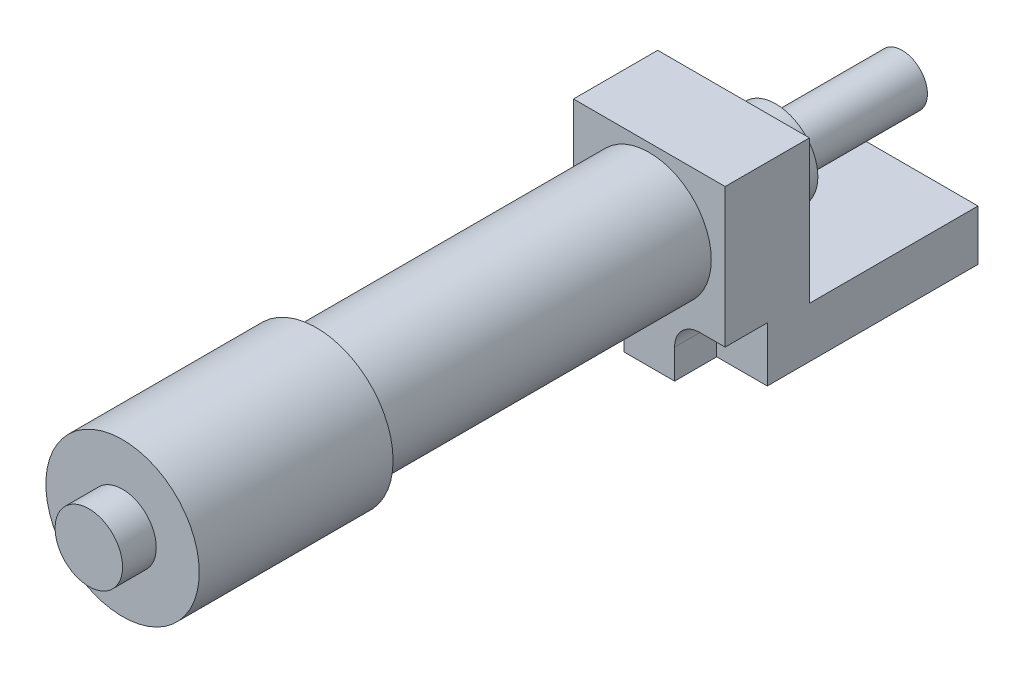
ISO-10303-21;
HEADER;
FILE_DESCRIPTION(('STEP AP214'),'2;1');
FILE_NAME('part.step','',(''),(''),'','','');
FILE_SCHEMA(('AUTOMOTIVE_DESIGN { 1 0 10303 214 1 1 1 1 }'));
ENDSEC;
DATA;
#1=APPLICATION_CONTEXT('core data for automotive mechanical design processes');
#2=APPLICATION_PROTOCOL_DEFINITION('international standard','automotive_design',2000,#1);
#3=PRODUCT_CONTEXT('',#1,'mechanical');
#4=PRODUCT('Part','Part','',(#3));
#5=PRODUCT_RELATED_PRODUCT_CATEGORY('part','',(#4));
#6=PRODUCT_DEFINITION_FORMATION('','',#4);
#7=PRODUCT_DEFINITION_CONTEXT('part definition',#1,'design');
#8=PRODUCT_DEFINITION('design','',#6,#7);
#9=PRODUCT_DEFINITION_SHAPE('','',#8);
#10=(LENGTH_UNIT() NAMED_UNIT(*) SI_UNIT(.MILLI.,.METRE.));
#11=(NAMED_UNIT(*) PLANE_ANGLE_UNIT() SI_UNIT($,.RADIAN.));
#12=(NAMED_UNIT(*) SI_UNIT($,.STERADIAN.) SOLID_ANGLE_UNIT());
#13=UNCERTAINTY_MEASURE_WITH_UNIT(LENGTH_MEASURE(1.E-05),#10,'distance_accuracy_value','');
#14=(GEOMETRIC_REPRESENTATION_CONTEXT(3) GLOBAL_UNCERTAINTY_ASSIGNED_CONTEXT((#13)) GLOBAL_UNIT_ASSIGNED_CONTEXT((#10,
#11,#12)) REPRESENTATION_CONTEXT('',''));
#15=CARTESIAN_POINT('',(0.,0.,0.));
#16=DIRECTION('',(0.,0.,1.));
#17=DIRECTION('',(1.,0.,0.));
#18=AXIS2_PLACEMENT_3D('',#15,#16,#17);
#19=CARTESIAN_POINT('',(18.,23.,0.));
#20=DIRECTION('',(0.,0.,-1.));
#21=DIRECTION('',(0.,1.,0.));
#22=AXIS2_PLACEMENT_3D('',#19,#20,#21);
#23=PLANE('',#22);
#24=CARTESIAN_POINT('',(9.,14.65,0.));
#25=DIRECTION('',(0.,0.,1.));
#26=DIRECTION('',(1.,0.,0.));
#27=AXIS2_PLACEMENT_3D('',#24,#25,#26);
#28=CIRCLE('',#27,7.35);
#29=CARTESIAN_POINT('',(16.35,14.65,0.));
#30=VERTEX_POINT('',#29);
#31=EDGE_CURVE('E60',#30,#30,#28,.T.);
#32=ORIENTED_EDGE('',*,*,#31,.F.);
#33=EDGE_LOOP('',(#32));
#34=FACE_BOUND('',#33,.T.);
#35=DIRECTION('',(0.,-1.,0.));
#36=VECTOR('',#35,1.);
#37=CARTESIAN_POINT('',(0.,23.,0.));
#38=LINE('',#37,#36);
#39=CARTESIAN_POINT('',(0.,23.,0.));
#40=VERTEX_POINT('',#39);
#41=CARTESIAN_POINT('',(0.,6.5,0.));
#42=VERTEX_POINT('',#41);
#43=EDGE_CURVE('E254',#40,#42,#38,.T.);
#44=ORIENTED_EDGE('',*,*,#43,.T.);
#45=DIRECTION('',(-1.,0.,0.));
#46=VECTOR('',#45,1.);
#47=CARTESIAN_POINT('',(3.,6.49999999999999,0.));
#48=LINE('',#47,#46);
#49=CARTESIAN_POINT('',(3.,6.5,0.));
#50=VERTEX_POINT('',#49);
#51=EDGE_CURVE('E176',#50,#42,#48,.T.);
#52=ORIENTED_EDGE('',*,*,#51,.F.);
#53=CARTESIAN_POINT('',(3.,3.5,0.));
#54=DIRECTION('',(0.,0.,-1.));
#55=DIRECTION('',(-1.,0.,0.));
#56=AXIS2_PLACEMENT_3D('',#53,#54,#55);
#57=CIRCLE('',#56,3.);
#58=CARTESIAN_POINT('',(6.,3.5,0.));
#59=VERTEX_POINT('',#58);
#60=EDGE_CURVE('E317',#50,#59,#57,.T.);
#61=ORIENTED_EDGE('',*,*,#60,.T.);
#62=DIRECTION('',(0.,1.,0.));
#63=VECTOR('',#62,1.);
#64=CARTESIAN_POINT('',(6.,0.,0.));
#65=LINE('',#64,#63);
#66=CARTESIAN_POINT('',(6.,0.,0.));
#67=VERTEX_POINT('',#66);
#68=EDGE_CURVE('E218',#67,#59,#65,.T.);
#69=ORIENTED_EDGE('',*,*,#68,.F.);
#70=DIRECTION('',(-1.,0.,0.));
#71=VECTOR('',#70,1.);
#72=CARTESIAN_POINT('',(18.,0.,0.));
#73=LINE('',#72,#71);
#74=CARTESIAN_POINT('',(12.,0.,0.));
#75=VERTEX_POINT('',#74);
#76=EDGE_CURVE('E182',#75,#67,#73,.T.);
#77=ORIENTED_EDGE('',*,*,#76,.F.);
#78=DIRECTION('',(0.,1.,0.));
#79=VECTOR('',#78,1.);
#80=CARTESIAN_POINT('',(12.,0.,0.));
#81=LINE('',#80,#79);
#82=CARTESIAN_POINT('',(12.,3.5,0.));
#83=VERTEX_POINT('',#82);
#84=EDGE_CURVE('E214',#75,#83,#81,.T.);
#85=ORIENTED_EDGE('',*,*,#84,.T.);
#86=CARTESIAN_POINT('',(15.,3.5,0.));
#87=DIRECTION('',(0.,0.,1.));
#88=DIRECTION('',(1.,0.,0.));
#89=AXIS2_PLACEMENT_3D('',#86,#87,#88);
#90=CIRCLE('',#89,3.);
#91=CARTESIAN_POINT('',(15.,6.49999999999999,0.));
#92=VERTEX_POINT('',#91);
#93=EDGE_CURVE('E209',#92,#83,#90,.T.);
#94=ORIENTED_EDGE('',*,*,#93,.F.);
#95=DIRECTION('',(1.,0.,0.));
#96=VECTOR('',#95,1.);
#97=CARTESIAN_POINT('',(15.,6.49999999999999,0.));
#98=LINE('',#97,#96);
#99=CARTESIAN_POINT('',(18.,6.5,0.));
#100=VERTEX_POINT('',#99);
#101=EDGE_CURVE('E205',#92,#100,#98,.T.);
#102=ORIENTED_EDGE('',*,*,#101,.T.);
#103=DIRECTION('',(0.,-1.,0.));
#104=VECTOR('',#103,1.);
#105=CARTESIAN_POINT('',(18.,23.,0.));
#106=LINE('',#105,#104);
#107=CARTESIAN_POINT('',(18.,23.,0.));
#108=VERTEX_POINT('',#107);
#109=EDGE_CURVE('E233',#108,#100,#106,.T.);
#110=ORIENTED_EDGE('',*,*,#109,.F.);
#111=DIRECTION('',(-1.,0.,0.));
#112=VECTOR('',#111,1.);
#113=CARTESIAN_POINT('',(18.,23.,0.));
#114=LINE('',#113,#112);
#115=EDGE_CURVE('E253',#108,#40,#114,.T.);
#116=ORIENTED_EDGE('',*,*,#115,.T.);
#117=EDGE_LOOP('',(#44,#52,#61,#69,#77,#85,#94,#102,#110,#116));
#118=FACE_BOUND('',#117,.T.);
#119=ADVANCED_FACE('F51',(#34,#118),#23,.F.);
#120=CARTESIAN_POINT('',(18.,0.,0.));
#121=DIRECTION('',(0.,1.,0.));
#122=DIRECTION('',(0.,0.,1.));
#123=AXIS2_PLACEMENT_3D('',#120,#121,#122);
#124=PLANE('',#123);
#125=ORIENTED_EDGE('',*,*,#76,.T.);
#126=DIRECTION('',(0.,0.,1.));
#127=VECTOR('',#126,1.);
#128=CARTESIAN_POINT('',(6.,0.,-5.));
#129=LINE('',#128,#127);
#130=CARTESIAN_POINT('',(6.,0.,-5.));
#131=VERTEX_POINT('',#130);
#132=EDGE_CURVE('E162',#131,#67,#129,.T.);
#133=ORIENTED_EDGE('',*,*,#132,.F.);
#134=DIRECTION('',(1.,0.,0.));
#135=VECTOR('',#134,1.);
#136=CARTESIAN_POINT('',(0.,0.,-5.));
#137=LINE('',#136,#135);
#138=CARTESIAN_POINT('',(0.,0.,-5.));
#139=VERTEX_POINT('',#138);
#140=EDGE_CURVE('E167',#139,#131,#137,.T.);
#141=ORIENTED_EDGE('',*,*,#140,.F.);
#142=DIRECTION('',(0.,0.,-1.));
#143=VECTOR('',#142,1.);
#144=CARTESIAN_POINT('',(0.,0.,0.));
#145=LINE('',#144,#143);
#146=CARTESIAN_POINT('',(0.,0.,-30.));
#147=VERTEX_POINT('',#146);
#148=EDGE_CURVE('E258',#139,#147,#145,.T.);
#149=ORIENTED_EDGE('',*,*,#148,.T.);
#150=DIRECTION('',(-1.,0.,0.));
#151=VECTOR('',#150,1.);
#152=CARTESIAN_POINT('',(18.,0.,-30.));
#153=LINE('',#152,#151);
#154=CARTESIAN_POINT('',(18.,0.,-30.));
#155=VERTEX_POINT('',#154);
#156=EDGE_CURVE('E288',#155,#147,#153,.T.);
#157=ORIENTED_EDGE('',*,*,#156,.F.);
#158=DIRECTION('',(0.,0.,-1.));
#159=VECTOR('',#158,1.);
#160=CARTESIAN_POINT('',(18.,0.,0.));
#161=LINE('',#160,#159);
#162=CARTESIAN_POINT('',(18.,0.,-5.));
#163=VERTEX_POINT('',#162);
#164=EDGE_CURVE('E237',#163,#155,#161,.T.);
#165=ORIENTED_EDGE('',*,*,#164,.F.);
#166=DIRECTION('',(-1.,0.,0.));
#167=VECTOR('',#166,1.);
#168=CARTESIAN_POINT('',(18.,0.,-5.));
#169=LINE('',#168,#167);
#170=CARTESIAN_POINT('',(12.,0.,-5.));
#171=VERTEX_POINT('',#170);
#172=EDGE_CURVE('E68',#163,#171,#169,.T.);
#173=ORIENTED_EDGE('',*,*,#172,.T.);
#174=DIRECTION('',(0.,0.,1.));
#175=VECTOR('',#174,1.);
#176=CARTESIAN_POINT('',(12.,0.,-5.));
#177=LINE('',#176,#175);
#178=EDGE_CURVE('E202',#171,#75,#177,.T.);
#179=ORIENTED_EDGE('',*,*,#178,.T.);
#180=EDGE_LOOP('',(#125,#133,#141,#149,#157,#165,#173,#179));
#181=FACE_BOUND('',#180,.T.);
#182=ADVANCED_FACE('F179',(#181),#124,.F.);
#183=CARTESIAN_POINT('',(18.,0.,0.));
#184=DIRECTION('',(1.,0.,0.));
#185=DIRECTION('',(0.,0.,-1.));
#186=AXIS2_PLACEMENT_3D('',#183,#184,#185);
#187=PLANE('',#186);
#188=ORIENTED_EDGE('',*,*,#109,.T.);
#189=DIRECTION('',(0.,0.,1.));
#190=VECTOR('',#189,1.);
#191=CARTESIAN_POINT('',(18.,6.5,-5.));
#192=LINE('',#191,#190);
#193=CARTESIAN_POINT('',(18.,6.5,-5.));
#194=VERTEX_POINT('',#193);
#195=EDGE_CURVE('E199',#194,#100,#192,.T.);
#196=ORIENTED_EDGE('',*,*,#195,.F.);
#197=DIRECTION('',(0.,-1.,0.));
#198=VECTOR('',#197,1.);
#199=CARTESIAN_POINT('',(18.,6.5,-5.));
#200=LINE('',#199,#198);
#201=EDGE_CURVE('E221',#194,#163,#200,.T.);
#202=ORIENTED_EDGE('',*,*,#201,.T.);
#203=ORIENTED_EDGE('',*,*,#164,.T.);
#204=DIRECTION('',(0.,1.,0.));
#205=VECTOR('',#204,1.);
#206=CARTESIAN_POINT('',(18.,0.,-30.));
#207=LINE('',#206,#205);
#208=CARTESIAN_POINT('',(18.,6.,-30.));
#209=VERTEX_POINT('',#208);
#210=EDGE_CURVE('E241',#155,#209,#207,.T.);
#211=ORIENTED_EDGE('',*,*,#210,.T.);
#212=DIRECTION('',(0.,0.,1.));
#213=VECTOR('',#212,1.);
#214=CARTESIAN_POINT('',(18.,6.,-30.));
#215=LINE('',#214,#213);
#216=CARTESIAN_POINT('',(18.,6.,-10.));
#217=VERTEX_POINT('',#216);
#218=EDGE_CURVE('E244',#209,#217,#215,.T.);
#219=ORIENTED_EDGE('',*,*,#218,.T.);
#220=DIRECTION('',(0.,1.,0.));
#221=VECTOR('',#220,1.);
#222=CARTESIAN_POINT('',(18.,6.,-10.));
#223=LINE('',#222,#221);
#224=CARTESIAN_POINT('',(18.,23.,-10.));
#225=VERTEX_POINT('',#224);
#226=EDGE_CURVE('E247',#217,#225,#223,.T.);
#227=ORIENTED_EDGE('',*,*,#226,.T.);
#228=DIRECTION('',(0.,0.,1.));
#229=VECTOR('',#228,1.);
#230=CARTESIAN_POINT('',(18.,23.,-10.));
#231=LINE('',#230,#229);
#232=EDGE_CURVE('E250',#225,#108,#231,.T.);
#233=ORIENTED_EDGE('',*,*,#232,.T.);
#234=EDGE_LOOP('',(#188,#196,#202,#203,#211,#219,#227,#233));
#235=FACE_BOUND('',#234,.T.);
#236=ADVANCED_FACE('F350',(#235),#187,.T.);
#237=CARTESIAN_POINT('',(18.,0.,-30.));
#238=DIRECTION('',(0.,0.,1.));
#239=DIRECTION('',(1.,0.,0.));
#240=AXIS2_PLACEMENT_3D('',#237,#238,#239);
#241=PLANE('',#240);
#242=DIRECTION('',(0.,1.,0.));
#243=VECTOR('',#242,1.);
#244=CARTESIAN_POINT('',(0.,0.,-30.));
#245=LINE('',#244,#243);
#246=CARTESIAN_POINT('',(0.,6.,-30.));
#247=VERTEX_POINT('',#246);
#248=EDGE_CURVE('E262',#147,#247,#245,.T.);
#249=ORIENTED_EDGE('',*,*,#248,.T.);
#250=DIRECTION('',(-1.,0.,0.));
#251=VECTOR('',#250,1.);
#252=CARTESIAN_POINT('',(18.,6.,-30.));
#253=LINE('',#252,#251);
#254=EDGE_CURVE('E284',#209,#247,#253,.T.);
#255=ORIENTED_EDGE('',*,*,#254,.F.);
#256=ORIENTED_EDGE('',*,*,#210,.F.);
#257=ORIENTED_EDGE('',*,*,#156,.T.);
#258=EDGE_LOOP('',(#249,#255,#256,#257));
#259=FACE_BOUND('',#258,.T.);
#260=ADVANCED_FACE('F346',(#259),#241,.F.);
#261=CARTESIAN_POINT('',(18.,6.,-30.));
#262=DIRECTION('',(0.,-1.,0.));
#263=DIRECTION('',(0.,0.,-1.));
#264=AXIS2_PLACEMENT_3D('',#261,#262,#263);
#265=PLANE('',#264);
#266=DIRECTION('',(0.,0.,1.));
#267=VECTOR('',#266,1.);
#268=CARTESIAN_POINT('',(0.,6.,-30.));
#269=LINE('',#268,#267);
#270=CARTESIAN_POINT('',(0.,6.,-10.));
#271=VERTEX_POINT('',#270);
#272=EDGE_CURVE('E265',#247,#271,#269,.T.);
#273=ORIENTED_EDGE('',*,*,#272,.T.);
#274=DIRECTION('',(-1.,0.,0.));
#275=VECTOR('',#274,1.);
#276=CARTESIAN_POINT('',(18.,6.,-10.));
#277=LINE('',#276,#275);
#278=EDGE_CURVE('E280',#217,#271,#277,.T.);
#279=ORIENTED_EDGE('',*,*,#278,.F.);
#280=ORIENTED_EDGE('',*,*,#218,.F.);
#281=ORIENTED_EDGE('',*,*,#254,.T.);
#282=EDGE_LOOP('',(#273,#279,#280,#281));
#283=FACE_BOUND('',#282,.T.);
#284=ADVANCED_FACE('F372',(#283),#265,.F.);
#285=CARTESIAN_POINT('',(18.,6.,-10.));
#286=DIRECTION('',(0.,0.,1.));
#287=DIRECTION('',(0.,-1.,0.));
#288=AXIS2_PLACEMENT_3D('',#285,#286,#287);
#289=PLANE('',#288);
#290=CARTESIAN_POINT('',(9.,14.5,-10.));
#291=DIRECTION('',(0.,0.,1.));
#292=DIRECTION('',(0.,-1.,0.));
#293=AXIS2_PLACEMENT_3D('',#290,#291,#292);
#294=CIRCLE('',#293,5.);
#295=CARTESIAN_POINT('',(9.,9.5,-10.));
#296=VERTEX_POINT('',#295);
#297=EDGE_CURVE('E54',#296,#296,#294,.F.);
#298=ORIENTED_EDGE('',*,*,#297,.F.);
#299=EDGE_LOOP('',(#298));
#300=FACE_BOUND('',#299,.T.);
#301=DIRECTION('',(0.,1.,0.));
#302=VECTOR('',#301,1.);
#303=CARTESIAN_POINT('',(0.,6.,-10.));
#304=LINE('',#303,#302);
#305=CARTESIAN_POINT('',(0.,23.,-10.));
#306=VERTEX_POINT('',#305);
#307=EDGE_CURVE('E268',#271,#306,#304,.T.);
#308=ORIENTED_EDGE('',*,*,#307,.T.);
#309=DIRECTION('',(-1.,0.,0.));
#310=VECTOR('',#309,1.);
#311=CARTESIAN_POINT('',(18.,23.,-10.));
#312=LINE('',#311,#310);
#313=EDGE_CURVE('E276',#225,#306,#312,.T.);
#314=ORIENTED_EDGE('',*,*,#313,.F.);
#315=ORIENTED_EDGE('',*,*,#226,.F.);
#316=ORIENTED_EDGE('',*,*,#278,.T.);
#317=EDGE_LOOP('',(#308,#314,#315,#316));
#318=FACE_BOUND('',#317,.T.);
#319=ADVANCED_FACE('F370',(#300,#318),#289,.F.);
#320=CARTESIAN_POINT('',(18.,23.,-10.));
#321=DIRECTION('',(0.,-1.,0.));
#322=DIRECTION('',(0.,0.,-1.));
#323=AXIS2_PLACEMENT_3D('',#320,#321,#322);
#324=PLANE('',#323);
#325=DIRECTION('',(0.,0.,1.));
#326=VECTOR('',#325,1.);
#327=CARTESIAN_POINT('',(0.,23.,-10.));
#328=LINE('',#327,#326);
#329=EDGE_CURVE('E238',#306,#40,#328,.T.);
#330=ORIENTED_EDGE('',*,*,#329,.T.);
#331=ORIENTED_EDGE('',*,*,#115,.F.);
#332=ORIENTED_EDGE('',*,*,#232,.F.);
#333=ORIENTED_EDGE('',*,*,#313,.T.);
#334=EDGE_LOOP('',(#330,#331,#332,#333));
#335=FACE_BOUND('',#334,.T.);
#336=ADVANCED_FACE('F368',(#335),#324,.F.);
#337=CARTESIAN_POINT('',(0.,0.,0.));
#338=DIRECTION('',(1.,0.,0.));
#339=DIRECTION('',(0.,0.,-1.));
#340=AXIS2_PLACEMENT_3D('',#337,#338,#339);
#341=PLANE('',#340);
#342=DIRECTION('',(0.,-1.,0.));
#343=VECTOR('',#342,1.);
#344=CARTESIAN_POINT('',(0.,6.5,-5.));
#345=LINE('',#344,#343);
#346=CARTESIAN_POINT('',(0.,6.5,-5.));
#347=VERTEX_POINT('',#346);
#348=EDGE_CURVE('E172',#347,#139,#345,.T.);
#349=ORIENTED_EDGE('',*,*,#348,.F.);
#350=DIRECTION('',(0.,0.,1.));
#351=VECTOR('',#350,1.);
#352=CARTESIAN_POINT('',(0.,6.5,-5.));
#353=LINE('',#352,#351);
#354=EDGE_CURVE('E259',#347,#42,#353,.T.);
#355=ORIENTED_EDGE('',*,*,#354,.T.);
#356=ORIENTED_EDGE('',*,*,#43,.F.);
#357=ORIENTED_EDGE('',*,*,#329,.F.);
#358=ORIENTED_EDGE('',*,*,#307,.F.);
#359=ORIENTED_EDGE('',*,*,#272,.F.);
#360=ORIENTED_EDGE('',*,*,#248,.F.);
#361=ORIENTED_EDGE('',*,*,#148,.F.);
#362=EDGE_LOOP('',(#349,#355,#356,#357,#358,#359,#360,#361));
#363=FACE_BOUND('',#362,.T.);
#364=ADVANCED_FACE('F338',(#363),#341,.F.);
#365=CARTESIAN_POINT('',(3.,6.49999999999999,-5.));
#366=DIRECTION('',(0.,1.,0.));
#367=DIRECTION('',(-1.,0.,0.));
#368=AXIS2_PLACEMENT_3D('',#365,#366,#367);
#369=PLANE('',#368);
#370=ORIENTED_EDGE('',*,*,#51,.T.);
#371=ORIENTED_EDGE('',*,*,#354,.F.);
#372=DIRECTION('',(-1.,0.,0.));
#373=VECTOR('',#372,1.);
#374=CARTESIAN_POINT('',(3.,6.49999999999999,-5.));
#375=LINE('',#374,#373);
#376=CARTESIAN_POINT('',(3.,6.5,-5.));
#377=VERTEX_POINT('',#376);
#378=EDGE_CURVE('E76',#377,#347,#375,.T.);
#379=ORIENTED_EDGE('',*,*,#378,.F.);
#380=DIRECTION('',(0.,0.,1.));
#381=VECTOR('',#380,1.);
#382=CARTESIAN_POINT('',(3.,6.5,-5.));
#383=LINE('',#382,#381);
#384=EDGE_CURVE('E187',#377,#50,#383,.T.);
#385=ORIENTED_EDGE('',*,*,#384,.T.);
#386=EDGE_LOOP('',(#370,#371,#379,#385));
#387=FACE_BOUND('',#386,.T.);
#388=ADVANCED_FACE('F328',(#387),#369,.F.);
#389=CARTESIAN_POINT('',(3.,3.5,-5.));
#390=DIRECTION('',(0.,0.,1.));
#391=DIRECTION('',(1.,0.,0.));
#392=AXIS2_PLACEMENT_3D('',#389,#390,#391);
#393=CYLINDRICAL_SURFACE('',#392,3.);
#394=ORIENTED_EDGE('',*,*,#60,.F.);
#395=ORIENTED_EDGE('',*,*,#384,.F.);
#396=CARTESIAN_POINT('',(3.,3.5,-5.));
#397=DIRECTION('',(0.,0.,-1.));
#398=DIRECTION('',(-1.,0.,0.));
#399=AXIS2_PLACEMENT_3D('',#396,#397,#398);
#400=CIRCLE('',#399,3.);
#401=CARTESIAN_POINT('',(6.,3.5,-5.));
#402=VERTEX_POINT('',#401);
#403=EDGE_CURVE('E166',#377,#402,#400,.T.);
#404=ORIENTED_EDGE('',*,*,#403,.T.);
#405=DIRECTION('',(0.,0.,1.));
#406=VECTOR('',#405,1.);
#407=CARTESIAN_POINT('',(6.,3.5,-5.));
#408=LINE('',#407,#406);
#409=EDGE_CURVE('E164',#402,#59,#408,.T.);
#410=ORIENTED_EDGE('',*,*,#409,.T.);
#411=EDGE_LOOP('',(#394,#395,#404,#410));
#412=FACE_BOUND('',#411,.T.);
#413=ADVANCED_FACE('F331',(#412),#393,.F.);
#414=CARTESIAN_POINT('',(6.,0.,-5.));
#415=DIRECTION('',(1.,0.,0.));
#416=DIRECTION('',(0.,1.,0.));
#417=AXIS2_PLACEMENT_3D('',#414,#415,#416);
#418=PLANE('',#417);
#419=ORIENTED_EDGE('',*,*,#68,.T.);
#420=ORIENTED_EDGE('',*,*,#409,.F.);
#421=DIRECTION('',(0.,1.,0.));
#422=VECTOR('',#421,1.);
#423=CARTESIAN_POINT('',(6.,0.,-5.));
#424=LINE('',#423,#422);
#425=EDGE_CURVE('E157',#131,#402,#424,.T.);
#426=ORIENTED_EDGE('',*,*,#425,.F.);
#427=ORIENTED_EDGE('',*,*,#132,.T.);
#428=EDGE_LOOP('',(#419,#420,#426,#427));
#429=FACE_BOUND('',#428,.T.);
#430=ADVANCED_FACE('F160',(#429),#418,.F.);
#431=CARTESIAN_POINT('',(3.,3.5,-5.));
#432=DIRECTION('',(0.,0.,-1.));
#433=DIRECTION('',(-1.,0.,0.));
#434=AXIS2_PLACEMENT_3D('',#431,#432,#433);
#435=PLANE('',#434);
#436=ORIENTED_EDGE('',*,*,#140,.T.);
#437=ORIENTED_EDGE('',*,*,#425,.T.);
#438=ORIENTED_EDGE('',*,*,#403,.F.);
#439=ORIENTED_EDGE('',*,*,#378,.T.);
#440=ORIENTED_EDGE('',*,*,#348,.T.);
#441=EDGE_LOOP('',(#436,#437,#438,#439,#440));
#442=FACE_BOUND('',#441,.T.);
#443=ADVANCED_FACE('F170',(#442),#435,.F.);
#444=CARTESIAN_POINT('',(12.,0.,-5.));
#445=DIRECTION('',(1.,0.,0.));
#446=DIRECTION('',(0.,0.,-1.));
#447=AXIS2_PLACEMENT_3D('',#444,#445,#446);
#448=PLANE('',#447);
#449=ORIENTED_EDGE('',*,*,#84,.F.);
#450=ORIENTED_EDGE('',*,*,#178,.F.);
#451=DIRECTION('',(0.,1.,0.));
#452=VECTOR('',#451,1.);
#453=CARTESIAN_POINT('',(12.,0.,-5.));
#454=LINE('',#453,#452);
#455=CARTESIAN_POINT('',(12.,3.5,-5.));
#456=VERTEX_POINT('',#455);
#457=EDGE_CURVE('E210',#171,#456,#454,.T.);
#458=ORIENTED_EDGE('',*,*,#457,.T.);
#459=DIRECTION('',(0.,0.,1.));
#460=VECTOR('',#459,1.);
#461=CARTESIAN_POINT('',(12.,3.5,-5.));
#462=LINE('',#461,#460);
#463=EDGE_CURVE('E192',#456,#83,#462,.T.);
#464=ORIENTED_EDGE('',*,*,#463,.T.);
#465=EDGE_LOOP('',(#449,#450,#458,#464));
#466=FACE_BOUND('',#465,.T.);
#467=ADVANCED_FACE('F355',(#466),#448,.T.);
#468=CARTESIAN_POINT('',(15.,3.5,-5.));
#469=DIRECTION('',(0.,0.,1.));
#470=DIRECTION('',(1.,0.,0.));
#471=AXIS2_PLACEMENT_3D('',#468,#469,#470);
#472=CYLINDRICAL_SURFACE('',#471,3.);
#473=ORIENTED_EDGE('',*,*,#93,.T.);
#474=ORIENTED_EDGE('',*,*,#463,.F.);
#475=CARTESIAN_POINT('',(15.,3.5,-5.));
#476=DIRECTION('',(0.,0.,1.));
#477=DIRECTION('',(1.,0.,0.));
#478=AXIS2_PLACEMENT_3D('',#475,#476,#477);
#479=CIRCLE('',#478,3.);
#480=CARTESIAN_POINT('',(15.,6.49999999999999,-5.));
#481=VERTEX_POINT('',#480);
#482=EDGE_CURVE('E227',#481,#456,#479,.T.);
#483=ORIENTED_EDGE('',*,*,#482,.F.);
#484=DIRECTION('',(0.,0.,1.));
#485=VECTOR('',#484,1.);
#486=CARTESIAN_POINT('',(15.,6.49999999999999,-5.));
#487=LINE('',#486,#485);
#488=EDGE_CURVE('E195',#481,#92,#487,.T.);
#489=ORIENTED_EDGE('',*,*,#488,.T.);
#490=EDGE_LOOP('',(#473,#474,#483,#489));
#491=FACE_BOUND('',#490,.T.);
#492=ADVANCED_FACE('F359',(#491),#472,.F.);
#493=CARTESIAN_POINT('',(15.,6.49999999999999,-5.));
#494=DIRECTION('',(0.,-1.,0.));
#495=DIRECTION('',(1.,0.,0.));
#496=AXIS2_PLACEMENT_3D('',#493,#494,#495);
#497=PLANE('',#496);
#498=ORIENTED_EDGE('',*,*,#101,.F.);
#499=ORIENTED_EDGE('',*,*,#488,.F.);
#500=DIRECTION('',(1.,0.,0.));
#501=VECTOR('',#500,1.);
#502=CARTESIAN_POINT('',(15.,6.49999999999999,-5.));
#503=LINE('',#502,#501);
#504=EDGE_CURVE('E224',#481,#194,#503,.T.);
#505=ORIENTED_EDGE('',*,*,#504,.T.);
#506=ORIENTED_EDGE('',*,*,#195,.T.);
#507=EDGE_LOOP('',(#498,#499,#505,#506));
#508=FACE_BOUND('',#507,.T.);
#509=ADVANCED_FACE('F363',(#508),#497,.T.);
#510=CARTESIAN_POINT('',(15.,3.5,-5.));
#511=DIRECTION('',(0.,0.,1.));
#512=DIRECTION('',(1.,0.,0.));
#513=AXIS2_PLACEMENT_3D('',#510,#511,#512);
#514=PLANE('',#513);
#515=ORIENTED_EDGE('',*,*,#457,.F.);
#516=ORIENTED_EDGE('',*,*,#172,.F.);
#517=ORIENTED_EDGE('',*,*,#201,.F.);
#518=ORIENTED_EDGE('',*,*,#504,.F.);
#519=ORIENTED_EDGE('',*,*,#482,.T.);
#520=EDGE_LOOP('',(#515,#516,#517,#518,#519));
#521=FACE_BOUND('',#520,.T.);
#522=ADVANCED_FACE('F419',(#521),#514,.T.);
#523=CARTESIAN_POINT('',(9.,14.5,-15.));
#524=DIRECTION('',(0.,0.,1.));
#525=DIRECTION('',(0.,-1.,0.));
#526=AXIS2_PLACEMENT_3D('',#523,#524,#525);
#527=CYLINDRICAL_SURFACE('',#526,5.);
#528=CARTESIAN_POINT('',(9.,14.5,-15.));
#529=DIRECTION('',(0.,0.,-1.));
#530=DIRECTION('',(0.,1.,0.));
#531=AXIS2_PLACEMENT_3D('',#528,#529,#530);
#532=CIRCLE('',#531,5.);
#533=CARTESIAN_POINT('',(9.,19.5,-15.));
#534=VERTEX_POINT('',#533);
#535=EDGE_CURVE('E196',#534,#534,#532,.T.);
#536=ORIENTED_EDGE('',*,*,#535,.F.);
#537=EDGE_LOOP('',(#536));
#538=FACE_BOUND('',#537,.T.);
#539=ORIENTED_EDGE('',*,*,#297,.T.);
#540=EDGE_LOOP('',(#539));
#541=FACE_BOUND('',#540,.T.);
#542=ADVANCED_FACE('F415',(#538,#541),#527,.T.);
#543=CARTESIAN_POINT('',(9.,14.5,-15.));
#544=DIRECTION('',(0.,0.,-1.));
#545=DIRECTION('',(0.,1.,0.));
#546=AXIS2_PLACEMENT_3D('',#543,#544,#545);
#547=PLANE('',#546);
#548=CARTESIAN_POINT('',(9.,14.5,-15.));
#549=DIRECTION('',(0.,0.,-1.));
#550=DIRECTION('',(0.,1.,0.));
#551=AXIS2_PLACEMENT_3D('',#548,#549,#550);
#552=CIRCLE('',#551,3.);
#553=CARTESIAN_POINT('',(9.,17.5,-15.));
#554=VERTEX_POINT('',#553);
#555=EDGE_CURVE('E294',#554,#554,#552,.T.);
#556=ORIENTED_EDGE('',*,*,#555,.F.);
#557=EDGE_LOOP('',(#556));
#558=FACE_BOUND('',#557,.T.);
#559=ORIENTED_EDGE('',*,*,#535,.T.);
#560=EDGE_LOOP('',(#559));
#561=FACE_BOUND('',#560,.T.);
#562=ADVANCED_FACE('F411',(#558,#561),#547,.T.);
#563=CARTESIAN_POINT('',(9.,14.5,-30.));
#564=DIRECTION('',(0.,0.,1.));
#565=DIRECTION('',(0.,-1.,0.));
#566=AXIS2_PLACEMENT_3D('',#563,#564,#565);
#567=CYLINDRICAL_SURFACE('',#566,3.);
#568=CARTESIAN_POINT('',(9.,14.5,-30.));
#569=DIRECTION('',(0.,0.,-1.));
#570=DIRECTION('',(0.,1.,0.));
#571=AXIS2_PLACEMENT_3D('',#568,#569,#570);
#572=CIRCLE('',#571,3.);
#573=CARTESIAN_POINT('',(9.,17.5,-30.));
#574=VERTEX_POINT('',#573);
#575=EDGE_CURVE('E307',#574,#574,#572,.T.);
#576=ORIENTED_EDGE('',*,*,#575,.F.);
#577=EDGE_LOOP('',(#576));
#578=FACE_BOUND('',#577,.T.);
#579=ORIENTED_EDGE('',*,*,#555,.T.);
#580=EDGE_LOOP('',(#579));
#581=FACE_BOUND('',#580,.T.);
#582=ADVANCED_FACE('F403',(#578,#581),#567,.T.);
#583=CARTESIAN_POINT('',(9.,14.5,-30.));
#584=DIRECTION('',(0.,0.,-1.));
#585=DIRECTION('',(0.,1.,0.));
#586=AXIS2_PLACEMENT_3D('',#583,#584,#585);
#587=PLANE('',#586);
#588=ORIENTED_EDGE('',*,*,#575,.T.);
#589=EDGE_LOOP('',(#588));
#590=FACE_BOUND('',#589,.T.);
#591=ADVANCED_FACE('F394',(#590),#587,.T.);
#592=CARTESIAN_POINT('',(9.,14.65,39.5));
#593=DIRECTION('',(0.,0.,-1.));
#594=DIRECTION('',(-1.,0.,0.));
#595=AXIS2_PLACEMENT_3D('',#592,#593,#594);
#596=CYLINDRICAL_SURFACE('',#595,7.35);
#597=CARTESIAN_POINT('',(9.,14.65,39.5));
#598=DIRECTION('',(0.,0.,1.));
#599=DIRECTION('',(1.,0.,0.));
#600=AXIS2_PLACEMENT_3D('',#597,#598,#599);
#601=CIRCLE('',#600,7.35);
#602=CARTESIAN_POINT('',(16.35,14.65,39.5));
#603=VERTEX_POINT('',#602);
#604=EDGE_CURVE('E595',#603,#603,#601,.T.);
#605=ORIENTED_EDGE('',*,*,#604,.F.);
#606=EDGE_LOOP('',(#605));
#607=FACE_BOUND('',#606,.T.);
#608=ORIENTED_EDGE('',*,*,#31,.T.);
#609=EDGE_LOOP('',(#608));
#610=FACE_BOUND('',#609,.T.);
#611=ADVANCED_FACE('F392',(#607,#610),#596,.T.);
#612=CARTESIAN_POINT('',(9.,14.65,62.5));
#613=DIRECTION('',(0.,0.,-1.));
#614=DIRECTION('',(-1.,0.,0.));
#615=AXIS2_PLACEMENT_3D('',#612,#613,#614);
#616=CYLINDRICAL_SURFACE('',#615,9.1);
#617=CARTESIAN_POINT('',(9.,14.65,62.5));
#618=DIRECTION('',(0.,0.,1.));
#619=DIRECTION('',(1.,0.,0.));
#620=AXIS2_PLACEMENT_3D('',#617,#618,#619);
#621=CIRCLE('',#620,9.1);
#622=CARTESIAN_POINT('',(18.1,14.65,62.5));
#623=VERTEX_POINT('',#622);
#624=EDGE_CURVE('E590',#623,#623,#621,.T.);
#625=ORIENTED_EDGE('',*,*,#624,.F.);
#626=EDGE_LOOP('',(#625));
#627=FACE_BOUND('',#626,.T.);
#628=CARTESIAN_POINT('',(9.,14.65,39.5));
#629=DIRECTION('',(0.,0.,1.));
#630=DIRECTION('',(1.,0.,0.));
#631=AXIS2_PLACEMENT_3D('',#628,#629,#630);
#632=CIRCLE('',#631,9.1);
#633=CARTESIAN_POINT('',(18.1,14.65,39.5));
#634=VERTEX_POINT('',#633);
#635=EDGE_CURVE('E586',#634,#634,#632,.T.);
#636=ORIENTED_EDGE('',*,*,#635,.T.);
#637=EDGE_LOOP('',(#636));
#638=FACE_BOUND('',#637,.T.);
#639=ADVANCED_FACE('F393',(#627,#638),#616,.T.);
#640=CARTESIAN_POINT('',(9.,14.65,62.5));
#641=DIRECTION('',(0.,0.,1.));
#642=DIRECTION('',(1.,0.,0.));
#643=AXIS2_PLACEMENT_3D('',#640,#641,#642);
#644=PLANE('',#643);
#645=CARTESIAN_POINT('',(9.,14.65,62.5));
#646=DIRECTION('',(0.,0.,1.));
#647=DIRECTION('',(1.,0.,0.));
#648=AXIS2_PLACEMENT_3D('',#645,#646,#647);
#649=CIRCLE('',#648,4.);
#650=CARTESIAN_POINT('',(13.,14.65,62.5));
#651=VERTEX_POINT('',#650);
#652=EDGE_CURVE('E11',#651,#651,#649,.T.);
#653=ORIENTED_EDGE('',*,*,#652,.F.);
#654=EDGE_LOOP('',(#653));
#655=FACE_BOUND('',#654,.T.);
#656=ORIENTED_EDGE('',*,*,#624,.T.);
#657=EDGE_LOOP('',(#656));
#658=FACE_BOUND('',#657,.T.);
#659=ADVANCED_FACE('F400',(#655,#658),#644,.T.);
#660=CARTESIAN_POINT('',(9.,14.65,39.5));
#661=DIRECTION('',(0.,0.,1.));
#662=DIRECTION('',(1.,0.,0.));
#663=AXIS2_PLACEMENT_3D('',#660,#661,#662);
#664=PLANE('',#663);
#665=ORIENTED_EDGE('',*,*,#604,.T.);
#666=EDGE_LOOP('',(#665));
#667=FACE_BOUND('',#666,.T.);
#668=ORIENTED_EDGE('',*,*,#635,.F.);
#669=EDGE_LOOP('',(#668));
#670=FACE_BOUND('',#669,.T.);
#671=ADVANCED_FACE('F551',(#667,#670),#664,.F.);
#672=CARTESIAN_POINT('',(9.,14.65,66.5));
#673=DIRECTION('',(0.,0.,-1.));
#674=DIRECTION('',(-1.,0.,0.));
#675=AXIS2_PLACEMENT_3D('',#672,#673,#674);
#676=CYLINDRICAL_SURFACE('',#675,4.);
#677=CARTESIAN_POINT('',(9.,14.65,66.5));
#678=DIRECTION('',(0.,0.,1.));
#679=DIRECTION('',(1.,0.,0.));
#680=AXIS2_PLACEMENT_3D('',#677,#678,#679);
#681=CIRCLE('',#680,4.);
#682=CARTESIAN_POINT('',(13.,14.65,66.5));
#683=VERTEX_POINT('',#682);
#684=EDGE_CURVE('E584',#683,#683,#681,.T.);
#685=ORIENTED_EDGE('',*,*,#684,.F.);
#686=EDGE_LOOP('',(#685));
#687=FACE_BOUND('',#686,.T.);
#688=ORIENTED_EDGE('',*,*,#652,.T.);
#689=EDGE_LOOP('',(#688));
#690=FACE_BOUND('',#689,.T.);
#691=ADVANCED_FACE('F561',(#687,#690),#676,.T.);
#692=CARTESIAN_POINT('',(9.,14.65,66.5));
#693=DIRECTION('',(0.,0.,1.));
#694=DIRECTION('',(1.,0.,0.));
#695=AXIS2_PLACEMENT_3D('',#692,#693,#694);
#696=PLANE('',#695);
#697=ORIENTED_EDGE('',*,*,#684,.T.);
#698=EDGE_LOOP('',(#697));
#699=FACE_BOUND('',#698,.T.);
#700=ADVANCED_FACE('F569',(#699),#696,.T.);
#701=CLOSED_SHELL('',(#119,#182,#236,#260,#284,#319,#336,#364,#388,#413,#430,#443,#467,#492,
#509,#522,#542,#562,#582,#591,#611,#639,#659,#671,#691,#700));
#702=MANIFOLD_SOLID_BREP('B2',#701);
#703=ADVANCED_BREP_SHAPE_REPRESENTATION('',(#18,#702),#14);
#704=SHAPE_DEFINITION_REPRESENTATION(#9,#703);
ENDSEC;
END-ISO-10303-21;
